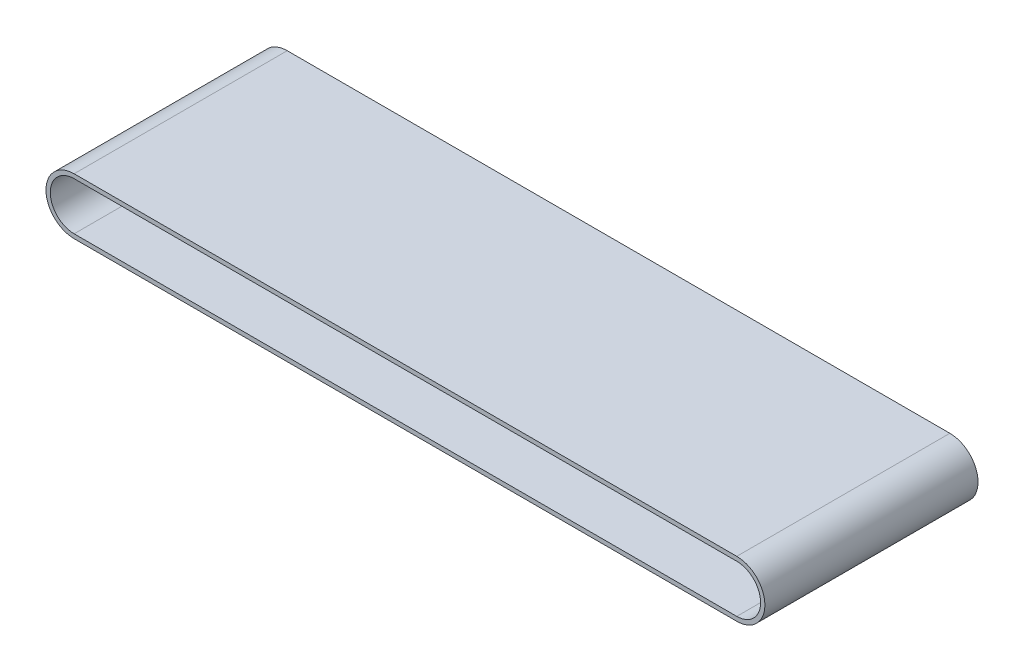
ISO-10303-21;
HEADER;
FILE_DESCRIPTION(('STEP AP214'),'2;1');
FILE_NAME('part.step','',(''),(''),'','','');
FILE_SCHEMA(('AUTOMOTIVE_DESIGN { 1 0 10303 214 1 1 1 1 }'));
ENDSEC;
DATA;
#1=APPLICATION_CONTEXT('core data for automotive mechanical design processes');
#2=APPLICATION_PROTOCOL_DEFINITION('international standard','automotive_design',2000,#1);
#3=PRODUCT_CONTEXT('',#1,'mechanical');
#4=PRODUCT('Part','Part','',(#3));
#5=PRODUCT_RELATED_PRODUCT_CATEGORY('part','',(#4));
#6=PRODUCT_DEFINITION_FORMATION('','',#4);
#7=PRODUCT_DEFINITION_CONTEXT('part definition',#1,'design');
#8=PRODUCT_DEFINITION('design','',#6,#7);
#9=PRODUCT_DEFINITION_SHAPE('','',#8);
#10=(LENGTH_UNIT() NAMED_UNIT(*) SI_UNIT(.MILLI.,.METRE.));
#11=(NAMED_UNIT(*) PLANE_ANGLE_UNIT() SI_UNIT($,.RADIAN.));
#12=(NAMED_UNIT(*) SI_UNIT($,.STERADIAN.) SOLID_ANGLE_UNIT());
#13=UNCERTAINTY_MEASURE_WITH_UNIT(LENGTH_MEASURE(1.E-05),#10,'distance_accuracy_value','');
#14=(GEOMETRIC_REPRESENTATION_CONTEXT(3) GLOBAL_UNCERTAINTY_ASSIGNED_CONTEXT((#13)) GLOBAL_UNIT_ASSIGNED_CONTEXT((#10,
#11,#12)) REPRESENTATION_CONTEXT('',''));
#15=CARTESIAN_POINT('',(0.,0.,0.));
#16=DIRECTION('',(0.,0.,1.));
#17=DIRECTION('',(1.,0.,0.));
#18=AXIS2_PLACEMENT_3D('',#15,#16,#17);
#19=CARTESIAN_POINT('',(266.703706937983,45.6153777603108,150.));
#20=DIRECTION('',(0.,0.,1.));
#21=DIRECTION('',(1.,0.,0.));
#22=AXIS2_PLACEMENT_3D('',#19,#20,#21);
#23=PLANE('',#22);
#24=CARTESIAN_POINT('',(266.703706937983,45.6153777603108,150.));
#25=DIRECTION('',(0.,0.,1.));
#26=DIRECTION('',(1.,0.,0.));
#27=AXIS2_PLACEMENT_3D('',#24,#25,#26);
#28=CIRCLE('',#27,19.8);
#29=CARTESIAN_POINT('',(266.703706937983,65.4153777603108,150.));
#30=VERTEX_POINT('',#29);
#31=CARTESIAN_POINT('',(266.703706937983,25.8153777603108,150.));
#32=VERTEX_POINT('',#31);
#33=EDGE_CURVE('E164',#30,#32,#28,.T.);
#34=ORIENTED_EDGE('',*,*,#33,.T.);
#35=DIRECTION('',(1.,0.,0.));
#36=VECTOR('',#35,1.);
#37=CARTESIAN_POINT('',(266.703706937983,25.8153777603108,150.));
#38=LINE('',#37,#36);
#39=CARTESIAN_POINT('',(733.103706937983,25.8153777603108,150.));
#40=VERTEX_POINT('',#39);
#41=EDGE_CURVE('E167',#32,#40,#38,.T.);
#42=ORIENTED_EDGE('',*,*,#41,.T.);
#43=CARTESIAN_POINT('',(733.103706937983,45.6153777603108,150.));
#44=DIRECTION('',(0.,0.,1.));
#45=DIRECTION('',(1.,0.,0.));
#46=AXIS2_PLACEMENT_3D('',#43,#44,#45);
#47=CIRCLE('',#46,19.8);
#48=CARTESIAN_POINT('',(733.103706937983,65.4153777603108,150.));
#49=VERTEX_POINT('',#48);
#50=EDGE_CURVE('E170',#40,#49,#47,.T.);
#51=ORIENTED_EDGE('',*,*,#50,.T.);
#52=DIRECTION('',(-1.,0.,0.));
#53=VECTOR('',#52,1.);
#54=CARTESIAN_POINT('',(266.703706937983,65.4153777603108,150.));
#55=LINE('',#54,#53);
#56=EDGE_CURVE('E172',#49,#30,#55,.T.);
#57=ORIENTED_EDGE('',*,*,#56,.T.);
#58=EDGE_LOOP('',(#34,#42,#51,#57));
#59=FACE_BOUND('',#58,.T.);
#60=DIRECTION('',(1.,0.,0.));
#61=VECTOR('',#60,1.);
#62=CARTESIAN_POINT('',(266.703706937983,28.8153777603108,150.));
#63=LINE('',#62,#61);
#64=CARTESIAN_POINT('',(266.703706937983,28.8153777603108,150.));
#65=VERTEX_POINT('',#64);
#66=CARTESIAN_POINT('',(733.103706937983,28.8153777603108,150.));
#67=VERTEX_POINT('',#66);
#68=EDGE_CURVE('E136',#65,#67,#63,.T.);
#69=ORIENTED_EDGE('',*,*,#68,.F.);
#70=CARTESIAN_POINT('',(266.703706937983,45.6153777603108,150.));
#71=DIRECTION('',(0.,0.,1.));
#72=DIRECTION('',(1.,0.,0.));
#73=AXIS2_PLACEMENT_3D('',#70,#71,#72);
#74=CIRCLE('',#73,16.8);
#75=CARTESIAN_POINT('',(266.703706937983,62.4153777603108,150.));
#76=VERTEX_POINT('',#75);
#77=EDGE_CURVE('E128',#76,#65,#74,.T.);
#78=ORIENTED_EDGE('',*,*,#77,.F.);
#79=DIRECTION('',(-1.,0.,0.));
#80=VECTOR('',#79,1.);
#81=CARTESIAN_POINT('',(266.703706937983,62.4153777603108,150.));
#82=LINE('',#81,#80);
#83=CARTESIAN_POINT('',(733.103706937983,62.4153777603108,150.));
#84=VERTEX_POINT('',#83);
#85=EDGE_CURVE('E150',#84,#76,#82,.T.);
#86=ORIENTED_EDGE('',*,*,#85,.F.);
#87=CARTESIAN_POINT('',(733.103706937983,45.6153777603108,150.));
#88=DIRECTION('',(0.,0.,1.));
#89=DIRECTION('',(-1.,0.,0.));
#90=AXIS2_PLACEMENT_3D('',#87,#88,#89);
#91=CIRCLE('',#90,16.8);
#92=EDGE_CURVE('E148',#67,#84,#91,.T.);
#93=ORIENTED_EDGE('',*,*,#92,.F.);
#94=EDGE_LOOP('',(#69,#78,#86,#93));
#95=FACE_BOUND('',#94,.T.);
#96=ADVANCED_FACE('F63',(#59,#95),#23,.T.);
#97=CARTESIAN_POINT('',(266.703706937983,45.6153777603108,0.));
#98=DIRECTION('',(0.,0.,1.));
#99=DIRECTION('',(1.,0.,0.));
#100=AXIS2_PLACEMENT_3D('',#97,#98,#99);
#101=PLANE('',#100);
#102=CARTESIAN_POINT('',(266.703706937983,45.6153777603108,0.));
#103=DIRECTION('',(0.,0.,1.));
#104=DIRECTION('',(1.,0.,0.));
#105=AXIS2_PLACEMENT_3D('',#102,#103,#104);
#106=CIRCLE('',#105,19.8);
#107=CARTESIAN_POINT('',(266.703706937983,65.4153777603108,0.));
#108=VERTEX_POINT('',#107);
#109=CARTESIAN_POINT('',(266.703706937983,25.8153777603108,0.));
#110=VERTEX_POINT('',#109);
#111=EDGE_CURVE('E144',#108,#110,#106,.T.);
#112=ORIENTED_EDGE('',*,*,#111,.F.);
#113=DIRECTION('',(-1.,0.,0.));
#114=VECTOR('',#113,1.);
#115=CARTESIAN_POINT('',(266.703706937983,65.4153777603108,0.));
#116=LINE('',#115,#114);
#117=CARTESIAN_POINT('',(733.103706937983,65.4153777603108,0.));
#118=VERTEX_POINT('',#117);
#119=EDGE_CURVE('E168',#118,#108,#116,.T.);
#120=ORIENTED_EDGE('',*,*,#119,.F.);
#121=CARTESIAN_POINT('',(733.103706937983,45.6153777603108,0.));
#122=DIRECTION('',(0.,0.,1.));
#123=DIRECTION('',(1.,0.,0.));
#124=AXIS2_PLACEMENT_3D('',#121,#122,#123);
#125=CIRCLE('',#124,19.8);
#126=CARTESIAN_POINT('',(733.103706937983,25.8153777603108,0.));
#127=VERTEX_POINT('',#126);
#128=EDGE_CURVE('E179',#127,#118,#125,.T.);
#129=ORIENTED_EDGE('',*,*,#128,.F.);
#130=DIRECTION('',(1.,0.,0.));
#131=VECTOR('',#130,1.);
#132=CARTESIAN_POINT('',(266.703706937983,25.8153777603108,0.));
#133=LINE('',#132,#131);
#134=EDGE_CURVE('E177',#110,#127,#133,.T.);
#135=ORIENTED_EDGE('',*,*,#134,.F.);
#136=EDGE_LOOP('',(#112,#120,#129,#135));
#137=FACE_BOUND('',#136,.T.);
#138=CARTESIAN_POINT('',(266.703706937983,45.6153777603108,0.));
#139=DIRECTION('',(0.,0.,1.));
#140=DIRECTION('',(1.,0.,0.));
#141=AXIS2_PLACEMENT_3D('',#138,#139,#140);
#142=CIRCLE('',#141,16.8);
#143=CARTESIAN_POINT('',(266.703706937983,62.4153777603108,0.));
#144=VERTEX_POINT('',#143);
#145=CARTESIAN_POINT('',(266.703706937983,28.8153777603108,0.));
#146=VERTEX_POINT('',#145);
#147=EDGE_CURVE('E86',#144,#146,#142,.T.);
#148=ORIENTED_EDGE('',*,*,#147,.T.);
#149=DIRECTION('',(1.,0.,0.));
#150=VECTOR('',#149,1.);
#151=CARTESIAN_POINT('',(266.703706937983,28.8153777603108,0.));
#152=LINE('',#151,#150);
#153=CARTESIAN_POINT('',(733.103706937983,28.8153777603108,0.));
#154=VERTEX_POINT('',#153);
#155=EDGE_CURVE('E143',#146,#154,#152,.T.);
#156=ORIENTED_EDGE('',*,*,#155,.T.);
#157=CARTESIAN_POINT('',(733.103706937983,45.6153777603108,0.));
#158=DIRECTION('',(0.,0.,1.));
#159=DIRECTION('',(-1.,0.,0.));
#160=AXIS2_PLACEMENT_3D('',#157,#158,#159);
#161=CIRCLE('',#160,16.8);
#162=CARTESIAN_POINT('',(733.103706937983,62.4153777603108,0.));
#163=VERTEX_POINT('',#162);
#164=EDGE_CURVE('E156',#154,#163,#161,.T.);
#165=ORIENTED_EDGE('',*,*,#164,.T.);
#166=DIRECTION('',(-1.,0.,0.));
#167=VECTOR('',#166,1.);
#168=CARTESIAN_POINT('',(266.703706937983,62.4153777603108,0.));
#169=LINE('',#168,#167);
#170=EDGE_CURVE('E137',#163,#144,#169,.T.);
#171=ORIENTED_EDGE('',*,*,#170,.T.);
#172=EDGE_LOOP('',(#148,#156,#165,#171));
#173=FACE_BOUND('',#172,.T.);
#174=ADVANCED_FACE('F197',(#137,#173),#101,.F.);
#175=CARTESIAN_POINT('',(266.703706937983,45.6153777603108,150.));
#176=DIRECTION('',(0.,0.,-1.));
#177=DIRECTION('',(-1.,0.,0.));
#178=AXIS2_PLACEMENT_3D('',#175,#176,#177);
#179=CYLINDRICAL_SURFACE('',#178,19.8);
#180=ORIENTED_EDGE('',*,*,#111,.T.);
#181=DIRECTION('',(0.,0.,-1.));
#182=VECTOR('',#181,1.);
#183=CARTESIAN_POINT('',(266.703706937983,25.8153777603108,150.));
#184=LINE('',#183,#182);
#185=EDGE_CURVE('E12',#32,#110,#184,.T.);
#186=ORIENTED_EDGE('',*,*,#185,.F.);
#187=ORIENTED_EDGE('',*,*,#33,.F.);
#188=DIRECTION('',(0.,0.,-1.));
#189=VECTOR('',#188,1.);
#190=CARTESIAN_POINT('',(266.703706937983,65.4153777603108,150.));
#191=LINE('',#190,#189);
#192=EDGE_CURVE('E174',#30,#108,#191,.T.);
#193=ORIENTED_EDGE('',*,*,#192,.T.);
#194=EDGE_LOOP('',(#180,#186,#187,#193));
#195=FACE_BOUND('',#194,.T.);
#196=ADVANCED_FACE('F65',(#195),#179,.T.);
#197=CARTESIAN_POINT('',(266.703706937983,25.8153777603108,150.));
#198=DIRECTION('',(0.,1.,0.));
#199=DIRECTION('',(0.,0.,1.));
#200=AXIS2_PLACEMENT_3D('',#197,#198,#199);
#201=PLANE('',#200);
#202=ORIENTED_EDGE('',*,*,#134,.T.);
#203=DIRECTION('',(0.,0.,-1.));
#204=VECTOR('',#203,1.);
#205=CARTESIAN_POINT('',(733.103706937983,25.8153777603108,150.));
#206=LINE('',#205,#204);
#207=EDGE_CURVE('E71',#40,#127,#206,.T.);
#208=ORIENTED_EDGE('',*,*,#207,.F.);
#209=ORIENTED_EDGE('',*,*,#41,.F.);
#210=ORIENTED_EDGE('',*,*,#185,.T.);
#211=EDGE_LOOP('',(#202,#208,#209,#210));
#212=FACE_BOUND('',#211,.T.);
#213=ADVANCED_FACE('F207',(#212),#201,.F.);
#214=CARTESIAN_POINT('',(733.103706937983,45.6153777603108,150.));
#215=DIRECTION('',(0.,0.,-1.));
#216=DIRECTION('',(-1.,0.,0.));
#217=AXIS2_PLACEMENT_3D('',#214,#215,#216);
#218=CYLINDRICAL_SURFACE('',#217,19.8);
#219=ORIENTED_EDGE('',*,*,#128,.T.);
#220=DIRECTION('',(0.,0.,-1.));
#221=VECTOR('',#220,1.);
#222=CARTESIAN_POINT('',(733.103706937983,65.4153777603108,150.));
#223=LINE('',#222,#221);
#224=EDGE_CURVE('E184',#49,#118,#223,.T.);
#225=ORIENTED_EDGE('',*,*,#224,.F.);
#226=ORIENTED_EDGE('',*,*,#50,.F.);
#227=ORIENTED_EDGE('',*,*,#207,.T.);
#228=EDGE_LOOP('',(#219,#225,#226,#227));
#229=FACE_BOUND('',#228,.T.);
#230=ADVANCED_FACE('F191',(#229),#218,.T.);
#231=CARTESIAN_POINT('',(266.703706937983,65.4153777603108,150.));
#232=DIRECTION('',(0.,-1.,0.));
#233=DIRECTION('',(0.,0.,-1.));
#234=AXIS2_PLACEMENT_3D('',#231,#232,#233);
#235=PLANE('',#234);
#236=ORIENTED_EDGE('',*,*,#119,.T.);
#237=ORIENTED_EDGE('',*,*,#192,.F.);
#238=ORIENTED_EDGE('',*,*,#56,.F.);
#239=ORIENTED_EDGE('',*,*,#224,.T.);
#240=EDGE_LOOP('',(#236,#237,#238,#239));
#241=FACE_BOUND('',#240,.T.);
#242=ADVANCED_FACE('F201',(#241),#235,.F.);
#243=CARTESIAN_POINT('',(266.703706937983,45.6153777603108,150.));
#244=DIRECTION('',(0.,0.,-1.));
#245=DIRECTION('',(-1.,0.,0.));
#246=AXIS2_PLACEMENT_3D('',#243,#244,#245);
#247=CYLINDRICAL_SURFACE('',#246,16.8);
#248=ORIENTED_EDGE('',*,*,#147,.F.);
#249=DIRECTION('',(0.,0.,-1.));
#250=VECTOR('',#249,1.);
#251=CARTESIAN_POINT('',(266.703706937983,62.4153777603108,150.));
#252=LINE('',#251,#250);
#253=EDGE_CURVE('E132',#76,#144,#252,.T.);
#254=ORIENTED_EDGE('',*,*,#253,.F.);
#255=ORIENTED_EDGE('',*,*,#77,.T.);
#256=DIRECTION('',(0.,0.,-1.));
#257=VECTOR('',#256,1.);
#258=CARTESIAN_POINT('',(266.703706937983,28.8153777603108,150.));
#259=LINE('',#258,#257);
#260=EDGE_CURVE('E131',#65,#146,#259,.T.);
#261=ORIENTED_EDGE('',*,*,#260,.T.);
#262=EDGE_LOOP('',(#248,#254,#255,#261));
#263=FACE_BOUND('',#262,.T.);
#264=ADVANCED_FACE('F130',(#263),#247,.F.);
#265=CARTESIAN_POINT('',(266.703706937983,28.8153777603108,150.));
#266=DIRECTION('',(0.,1.,0.));
#267=DIRECTION('',(0.,0.,1.));
#268=AXIS2_PLACEMENT_3D('',#265,#266,#267);
#269=PLANE('',#268);
#270=ORIENTED_EDGE('',*,*,#155,.F.);
#271=ORIENTED_EDGE('',*,*,#260,.F.);
#272=ORIENTED_EDGE('',*,*,#68,.T.);
#273=DIRECTION('',(0.,0.,-1.));
#274=VECTOR('',#273,1.);
#275=CARTESIAN_POINT('',(733.103706937983,28.8153777603108,150.));
#276=LINE('',#275,#274);
#277=EDGE_CURVE('E145',#67,#154,#276,.T.);
#278=ORIENTED_EDGE('',*,*,#277,.T.);
#279=EDGE_LOOP('',(#270,#271,#272,#278));
#280=FACE_BOUND('',#279,.T.);
#281=ADVANCED_FACE('F140',(#280),#269,.T.);
#282=CARTESIAN_POINT('',(733.103706937983,45.6153777603108,150.));
#283=DIRECTION('',(0.,0.,-1.));
#284=DIRECTION('',(-1.,0.,0.));
#285=AXIS2_PLACEMENT_3D('',#282,#283,#284);
#286=CYLINDRICAL_SURFACE('',#285,16.8);
#287=ORIENTED_EDGE('',*,*,#164,.F.);
#288=ORIENTED_EDGE('',*,*,#277,.F.);
#289=ORIENTED_EDGE('',*,*,#92,.T.);
#290=DIRECTION('',(0.,0.,-1.));
#291=VECTOR('',#290,1.);
#292=CARTESIAN_POINT('',(733.103706937983,62.4153777603108,150.));
#293=LINE('',#292,#291);
#294=EDGE_CURVE('E78',#84,#163,#293,.T.);
#295=ORIENTED_EDGE('',*,*,#294,.T.);
#296=EDGE_LOOP('',(#287,#288,#289,#295));
#297=FACE_BOUND('',#296,.T.);
#298=ADVANCED_FACE('F230',(#297),#286,.F.);
#299=CARTESIAN_POINT('',(266.703706937983,62.4153777603108,150.));
#300=DIRECTION('',(0.,-1.,0.));
#301=DIRECTION('',(0.,0.,-1.));
#302=AXIS2_PLACEMENT_3D('',#299,#300,#301);
#303=PLANE('',#302);
#304=ORIENTED_EDGE('',*,*,#170,.F.);
#305=ORIENTED_EDGE('',*,*,#294,.F.);
#306=ORIENTED_EDGE('',*,*,#85,.T.);
#307=ORIENTED_EDGE('',*,*,#253,.T.);
#308=EDGE_LOOP('',(#304,#305,#306,#307));
#309=FACE_BOUND('',#308,.T.);
#310=ADVANCED_FACE('F234',(#309),#303,.T.);
#311=CLOSED_SHELL('',(#96,#174,#196,#213,#230,#242,#264,#281,#298,#310));
#312=MANIFOLD_SOLID_BREP('B2',#311);
#313=ADVANCED_BREP_SHAPE_REPRESENTATION('',(#18,#312),#14);
#314=SHAPE_DEFINITION_REPRESENTATION(#9,#313);
ENDSEC;
END-ISO-10303-21;
